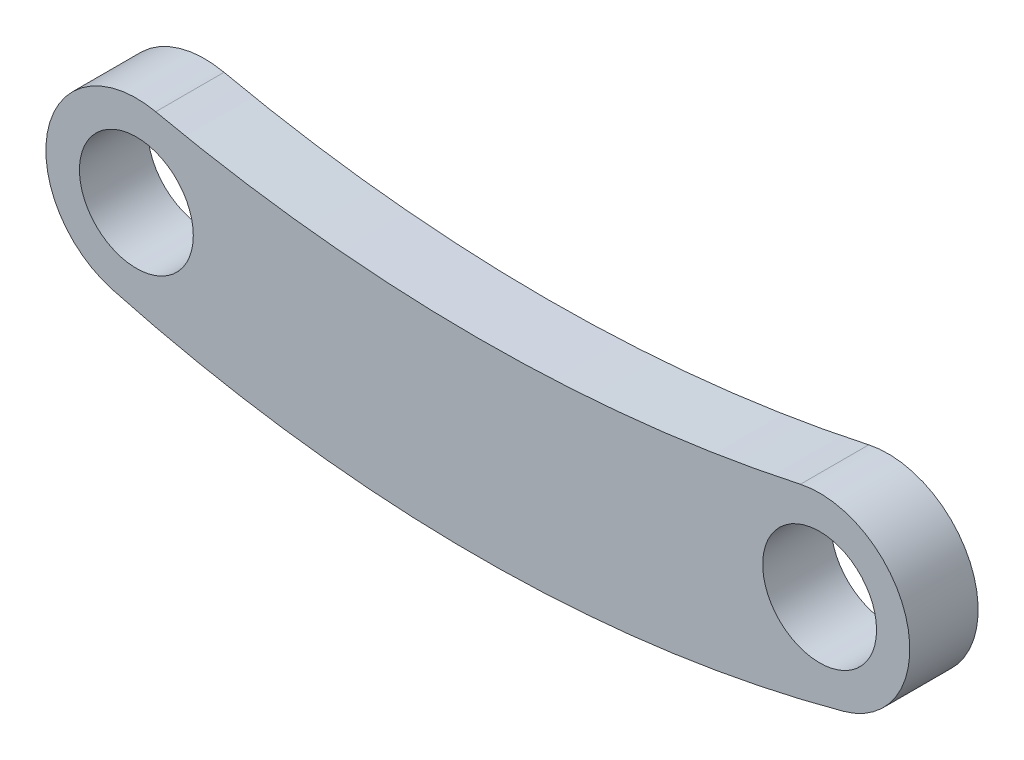
ISO-10303-21;
HEADER;
FILE_DESCRIPTION(('STEP AP214'),'2;1');
FILE_NAME('part.step','',(''),(''),'','','');
FILE_SCHEMA(('AUTOMOTIVE_DESIGN { 1 0 10303 214 1 1 1 1 }'));
ENDSEC;
DATA;
#1=APPLICATION_CONTEXT('core data for automotive mechanical design processes');
#2=APPLICATION_PROTOCOL_DEFINITION('international standard','automotive_design',2000,#1);
#3=PRODUCT_CONTEXT('',#1,'mechanical');
#4=PRODUCT('Part','Part','',(#3));
#5=PRODUCT_RELATED_PRODUCT_CATEGORY('part','',(#4));
#6=PRODUCT_DEFINITION_FORMATION('','',#4);
#7=PRODUCT_DEFINITION_CONTEXT('part definition',#1,'design');
#8=PRODUCT_DEFINITION('design','',#6,#7);
#9=PRODUCT_DEFINITION_SHAPE('','',#8);
#10=(LENGTH_UNIT() NAMED_UNIT(*) SI_UNIT(.MILLI.,.METRE.));
#11=(NAMED_UNIT(*) PLANE_ANGLE_UNIT() SI_UNIT($,.RADIAN.));
#12=(NAMED_UNIT(*) SI_UNIT($,.STERADIAN.) SOLID_ANGLE_UNIT());
#13=UNCERTAINTY_MEASURE_WITH_UNIT(LENGTH_MEASURE(1.E-05),#10,'distance_accuracy_value','');
#14=(GEOMETRIC_REPRESENTATION_CONTEXT(3) GLOBAL_UNCERTAINTY_ASSIGNED_CONTEXT((#13)) GLOBAL_UNIT_ASSIGNED_CONTEXT((#10,
#11,#12)) REPRESENTATION_CONTEXT('',''));
#15=CARTESIAN_POINT('',(0.,0.,0.));
#16=DIRECTION('',(0.,0.,1.));
#17=DIRECTION('',(1.,0.,0.));
#18=AXIS2_PLACEMENT_3D('',#15,#16,#17);
#19=CARTESIAN_POINT('',(7.51540284263749,34.3521395527499,3.));
#20=DIRECTION('',(0.,0.,1.));
#21=DIRECTION('',(1.,0.,0.));
#22=AXIS2_PLACEMENT_3D('',#19,#20,#21);
#23=PLANE('',#22);
#24=CARTESIAN_POINT('',(-15.,0.,3.));
#25=DIRECTION('',(0.,0.,1.));
#26=DIRECTION('',(1.,0.,0.));
#27=AXIS2_PLACEMENT_3D('',#24,#25,#26);
#28=CIRCLE('',#27,2.5);
#29=CARTESIAN_POINT('',(-12.5,0.,3.));
#30=VERTEX_POINT('',#29);
#31=EDGE_CURVE('E106',#30,#30,#28,.T.);
#32=ORIENTED_EDGE('',*,*,#31,.F.);
#33=EDGE_LOOP('',(#32));
#34=FACE_BOUND('',#33,.T.);
#35=CARTESIAN_POINT('',(0.0308056852749793,68.7042791054998,3.));
#36=DIRECTION('',(0.,0.,-1.));
#37=DIRECTION('',(1.,0.,0.));
#38=AXIS2_PLACEMENT_3D('',#35,#36,#37);
#39=CIRCLE('',#38,66.3556302561173);
#40=CARTESIAN_POINT('',(14.1568769569694,3.86969129071101,3.));
#41=VERTEX_POINT('',#40);
#42=CARTESIAN_POINT('',(-14.1507562768747,3.8818064050523,3.));
#43=VERTEX_POINT('',#42);
#44=EDGE_CURVE('E91',#41,#43,#39,.T.);
#45=ORIENTED_EDGE('',*,*,#44,.T.);
#46=CARTESIAN_POINT('',(-15.,0.,3.));
#47=DIRECTION('',(0.,0.,1.));
#48=DIRECTION('',(1.,0.,0.));
#49=AXIS2_PLACEMENT_3D('',#46,#47,#48);
#50=CIRCLE('',#49,3.97361747876829);
#51=CARTESIAN_POINT('',(-16.0366803954563,-3.83600438285065,3.));
#52=VERTEX_POINT('',#51);
#53=EDGE_CURVE('E86',#43,#52,#50,.T.);
#54=ORIENTED_EDGE('',*,*,#53,.T.);
#55=CARTESIAN_POINT('',(-0.0251471591177551,55.4111000670389,3.));
#56=DIRECTION('',(0.,0.,1.));
#57=DIRECTION('',(1.,0.,0.));
#58=AXIS2_PLACEMENT_3D('',#55,#56,#57);
#59=CIRCLE('',#58,61.3725393174708);
#60=CARTESIAN_POINT('',(16.036484759606,-3.82244247755258,3.));
#61=VERTEX_POINT('',#60);
#62=EDGE_CURVE('E89',#52,#61,#59,.T.);
#63=ORIENTED_EDGE('',*,*,#62,.T.);
#64=CARTESIAN_POINT('',(15.,0.,3.));
#65=DIRECTION('',(0.,0.,1.));
#66=DIRECTION('',(1.,0.,0.));
#67=AXIS2_PLACEMENT_3D('',#64,#65,#66);
#68=CIRCLE('',#67,3.96047562182799);
#69=EDGE_CURVE('E56',#61,#41,#68,.T.);
#70=ORIENTED_EDGE('',*,*,#69,.T.);
#71=EDGE_LOOP('',(#45,#54,#63,#70));
#72=FACE_BOUND('',#71,.T.);
#73=CARTESIAN_POINT('',(15.,0.,3.));
#74=DIRECTION('',(0.,0.,1.));
#75=DIRECTION('',(1.,0.,0.));
#76=AXIS2_PLACEMENT_3D('',#73,#74,#75);
#77=CIRCLE('',#76,2.5);
#78=CARTESIAN_POINT('',(17.5,0.,3.));
#79=VERTEX_POINT('',#78);
#80=EDGE_CURVE('E121',#79,#79,#77,.T.);
#81=ORIENTED_EDGE('',*,*,#80,.F.);
#82=EDGE_LOOP('',(#81));
#83=FACE_BOUND('',#82,.T.);
#84=ADVANCED_FACE('F39',(#34,#72,#83),#23,.T.);
#85=CARTESIAN_POINT('',(7.51540284263749,34.3521395527499,0.));
#86=DIRECTION('',(0.,0.,1.));
#87=DIRECTION('',(1.,0.,0.));
#88=AXIS2_PLACEMENT_3D('',#85,#86,#87);
#89=PLANE('',#88);
#90=CARTESIAN_POINT('',(0.0308056852749793,68.7042791054998,0.));
#91=DIRECTION('',(0.,0.,-1.));
#92=DIRECTION('',(1.,0.,0.));
#93=AXIS2_PLACEMENT_3D('',#90,#91,#92);
#94=CIRCLE('',#93,66.3556302561173);
#95=CARTESIAN_POINT('',(14.1568769569694,3.86969129071101,0.));
#96=VERTEX_POINT('',#95);
#97=CARTESIAN_POINT('',(-14.1507562768747,3.8818064050523,0.));
#98=VERTEX_POINT('',#97);
#99=EDGE_CURVE('E103',#96,#98,#94,.T.);
#100=ORIENTED_EDGE('',*,*,#99,.F.);
#101=CARTESIAN_POINT('',(15.,0.,0.));
#102=DIRECTION('',(0.,0.,1.));
#103=DIRECTION('',(1.,0.,0.));
#104=AXIS2_PLACEMENT_3D('',#101,#102,#103);
#105=CIRCLE('',#104,3.96047562182799);
#106=CARTESIAN_POINT('',(16.036484759606,-3.82244247755258,0.));
#107=VERTEX_POINT('',#106);
#108=EDGE_CURVE('E79',#107,#96,#105,.T.);
#109=ORIENTED_EDGE('',*,*,#108,.F.);
#110=CARTESIAN_POINT('',(-0.0251471591177551,55.4111000670389,0.));
#111=DIRECTION('',(0.,0.,1.));
#112=DIRECTION('',(1.,0.,0.));
#113=AXIS2_PLACEMENT_3D('',#110,#111,#112);
#114=CIRCLE('',#113,61.3725393174708);
#115=CARTESIAN_POINT('',(-16.0366803954563,-3.83600438285065,0.));
#116=VERTEX_POINT('',#115);
#117=EDGE_CURVE('E73',#116,#107,#114,.T.);
#118=ORIENTED_EDGE('',*,*,#117,.F.);
#119=CARTESIAN_POINT('',(-15.,0.,0.));
#120=DIRECTION('',(0.,0.,1.));
#121=DIRECTION('',(1.,0.,0.));
#122=AXIS2_PLACEMENT_3D('',#119,#120,#121);
#123=CIRCLE('',#122,3.97361747876829);
#124=EDGE_CURVE('E95',#98,#116,#123,.T.);
#125=ORIENTED_EDGE('',*,*,#124,.F.);
#126=EDGE_LOOP('',(#100,#109,#118,#125));
#127=FACE_BOUND('',#126,.T.);
#128=CARTESIAN_POINT('',(-15.,0.,0.));
#129=DIRECTION('',(0.,0.,1.));
#130=DIRECTION('',(1.,0.,0.));
#131=AXIS2_PLACEMENT_3D('',#128,#129,#130);
#132=CIRCLE('',#131,2.5);
#133=CARTESIAN_POINT('',(-12.5,0.,0.));
#134=VERTEX_POINT('',#133);
#135=EDGE_CURVE('E118',#134,#134,#132,.T.);
#136=ORIENTED_EDGE('',*,*,#135,.T.);
#137=EDGE_LOOP('',(#136));
#138=FACE_BOUND('',#137,.T.);
#139=CARTESIAN_POINT('',(15.,0.,0.));
#140=DIRECTION('',(0.,0.,1.));
#141=DIRECTION('',(1.,0.,0.));
#142=AXIS2_PLACEMENT_3D('',#139,#140,#141);
#143=CIRCLE('',#142,2.5);
#144=CARTESIAN_POINT('',(17.5,0.,0.));
#145=VERTEX_POINT('',#144);
#146=EDGE_CURVE('E124',#145,#145,#143,.T.);
#147=ORIENTED_EDGE('',*,*,#146,.T.);
#148=EDGE_LOOP('',(#147));
#149=FACE_BOUND('',#148,.T.);
#150=ADVANCED_FACE('F114',(#127,#138,#149),#89,.F.);
#151=CARTESIAN_POINT('',(0.0308056852749793,68.7042791054998,3.));
#152=DIRECTION('',(0.,0.,-1.));
#153=DIRECTION('',(-1.,0.,0.));
#154=AXIS2_PLACEMENT_3D('',#151,#152,#153);
#155=CYLINDRICAL_SURFACE('',#154,66.3556302561173);
#156=ORIENTED_EDGE('',*,*,#99,.T.);
#157=DIRECTION('',(0.,0.,-1.));
#158=VECTOR('',#157,1.);
#159=CARTESIAN_POINT('',(-14.1507562768747,3.8818064050523,3.));
#160=LINE('',#159,#158);
#161=EDGE_CURVE('E11',#43,#98,#160,.T.);
#162=ORIENTED_EDGE('',*,*,#161,.F.);
#163=ORIENTED_EDGE('',*,*,#44,.F.);
#164=DIRECTION('',(0.,0.,-1.));
#165=VECTOR('',#164,1.);
#166=CARTESIAN_POINT('',(14.1568769569694,3.86969129071101,3.));
#167=LINE('',#166,#165);
#168=EDGE_CURVE('E99',#41,#96,#167,.T.);
#169=ORIENTED_EDGE('',*,*,#168,.T.);
#170=EDGE_LOOP('',(#156,#162,#163,#169));
#171=FACE_BOUND('',#170,.T.);
#172=ADVANCED_FACE('F41',(#171),#155,.F.);
#173=CARTESIAN_POINT('',(-15.,0.,3.));
#174=DIRECTION('',(0.,0.,-1.));
#175=DIRECTION('',(-1.,0.,0.));
#176=AXIS2_PLACEMENT_3D('',#173,#174,#175);
#177=CYLINDRICAL_SURFACE('',#176,3.97361747876829);
#178=ORIENTED_EDGE('',*,*,#124,.T.);
#179=DIRECTION('',(0.,0.,-1.));
#180=VECTOR('',#179,1.);
#181=CARTESIAN_POINT('',(-16.0366803954563,-3.83600438285065,3.));
#182=LINE('',#181,#180);
#183=EDGE_CURVE('E48',#52,#116,#182,.T.);
#184=ORIENTED_EDGE('',*,*,#183,.F.);
#185=ORIENTED_EDGE('',*,*,#53,.F.);
#186=ORIENTED_EDGE('',*,*,#161,.T.);
#187=EDGE_LOOP('',(#178,#184,#185,#186));
#188=FACE_BOUND('',#187,.T.);
#189=ADVANCED_FACE('F94',(#188),#177,.T.);
#190=CARTESIAN_POINT('',(-0.0251471591177551,55.4111000670389,3.));
#191=DIRECTION('',(0.,0.,-1.));
#192=DIRECTION('',(-1.,0.,0.));
#193=AXIS2_PLACEMENT_3D('',#190,#191,#192);
#194=CYLINDRICAL_SURFACE('',#193,61.3725393174708);
#195=ORIENTED_EDGE('',*,*,#117,.T.);
#196=DIRECTION('',(0.,0.,-1.));
#197=VECTOR('',#196,1.);
#198=CARTESIAN_POINT('',(16.036484759606,-3.82244247755258,3.));
#199=LINE('',#198,#197);
#200=EDGE_CURVE('E96',#61,#107,#199,.T.);
#201=ORIENTED_EDGE('',*,*,#200,.F.);
#202=ORIENTED_EDGE('',*,*,#62,.F.);
#203=ORIENTED_EDGE('',*,*,#183,.T.);
#204=EDGE_LOOP('',(#195,#201,#202,#203));
#205=FACE_BOUND('',#204,.T.);
#206=ADVANCED_FACE('F97',(#205),#194,.T.);
#207=CARTESIAN_POINT('',(15.,0.,3.));
#208=DIRECTION('',(0.,0.,-1.));
#209=DIRECTION('',(-1.,0.,0.));
#210=AXIS2_PLACEMENT_3D('',#207,#208,#209);
#211=CYLINDRICAL_SURFACE('',#210,3.96047562182799);
#212=ORIENTED_EDGE('',*,*,#108,.T.);
#213=ORIENTED_EDGE('',*,*,#168,.F.);
#214=ORIENTED_EDGE('',*,*,#69,.F.);
#215=ORIENTED_EDGE('',*,*,#200,.T.);
#216=EDGE_LOOP('',(#212,#213,#214,#215));
#217=FACE_BOUND('',#216,.T.);
#218=ADVANCED_FACE('F111',(#217),#211,.T.);
#219=CARTESIAN_POINT('',(-15.,0.,3.));
#220=DIRECTION('',(0.,0.,-1.));
#221=DIRECTION('',(-1.,0.,0.));
#222=AXIS2_PLACEMENT_3D('',#219,#220,#221);
#223=CYLINDRICAL_SURFACE('',#222,2.5);
#224=ORIENTED_EDGE('',*,*,#31,.T.);
#225=EDGE_LOOP('',(#224));
#226=FACE_BOUND('',#225,.T.);
#227=ORIENTED_EDGE('',*,*,#135,.F.);
#228=EDGE_LOOP('',(#227));
#229=FACE_BOUND('',#228,.T.);
#230=ADVANCED_FACE('F141',(#226,#229),#223,.F.);
#231=CARTESIAN_POINT('',(15.,0.,3.));
#232=DIRECTION('',(0.,0.,-1.));
#233=DIRECTION('',(-1.,0.,0.));
#234=AXIS2_PLACEMENT_3D('',#231,#232,#233);
#235=CYLINDRICAL_SURFACE('',#234,2.5);
#236=ORIENTED_EDGE('',*,*,#80,.T.);
#237=EDGE_LOOP('',(#236));
#238=FACE_BOUND('',#237,.T.);
#239=ORIENTED_EDGE('',*,*,#146,.F.);
#240=EDGE_LOOP('',(#239));
#241=FACE_BOUND('',#240,.T.);
#242=ADVANCED_FACE('F130',(#238,#241),#235,.F.);
#243=CLOSED_SHELL('',(#84,#150,#172,#189,#206,#218,#230,#242));
#244=MANIFOLD_SOLID_BREP('B2',#243);
#245=ADVANCED_BREP_SHAPE_REPRESENTATION('',(#18,#244),#14);
#246=SHAPE_DEFINITION_REPRESENTATION(#9,#245);
ENDSEC;
END-ISO-10303-21;
